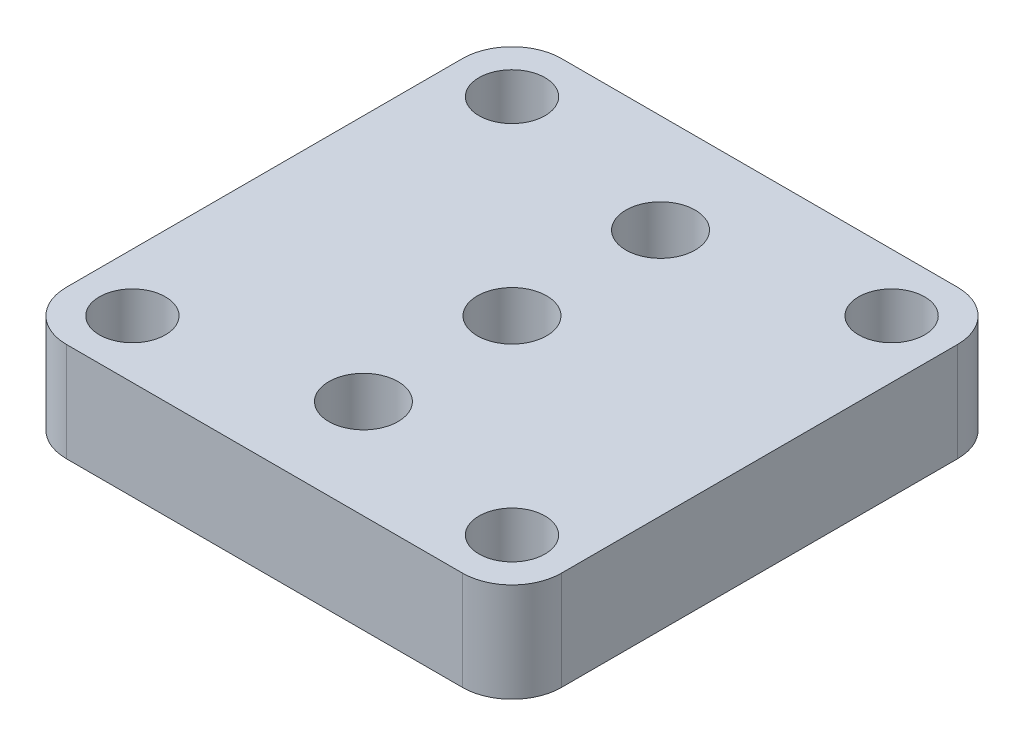
ISO-10303-21;
HEADER;
FILE_DESCRIPTION(('STEP AP214'),'2;1');
FILE_NAME('part.step','',(''),(''),'','','');
FILE_SCHEMA(('AUTOMOTIVE_DESIGN { 1 0 10303 214 1 1 1 1 }'));
ENDSEC;
DATA;
#1=APPLICATION_CONTEXT('core data for automotive mechanical design processes');
#2=APPLICATION_PROTOCOL_DEFINITION('international standard','automotive_design',2000,#1);
#3=PRODUCT_CONTEXT('',#1,'mechanical');
#4=PRODUCT('Part','Part','',(#3));
#5=PRODUCT_RELATED_PRODUCT_CATEGORY('part','',(#4));
#6=PRODUCT_DEFINITION_FORMATION('','',#4);
#7=PRODUCT_DEFINITION_CONTEXT('part definition',#1,'design');
#8=PRODUCT_DEFINITION('design','',#6,#7);
#9=PRODUCT_DEFINITION_SHAPE('','',#8);
#10=(LENGTH_UNIT() NAMED_UNIT(*) SI_UNIT(.MILLI.,.METRE.));
#11=(NAMED_UNIT(*) PLANE_ANGLE_UNIT() SI_UNIT($,.RADIAN.));
#12=(NAMED_UNIT(*) SI_UNIT($,.STERADIAN.) SOLID_ANGLE_UNIT());
#13=UNCERTAINTY_MEASURE_WITH_UNIT(LENGTH_MEASURE(1.E-05),#10,'distance_accuracy_value','');
#14=(GEOMETRIC_REPRESENTATION_CONTEXT(3) GLOBAL_UNCERTAINTY_ASSIGNED_CONTEXT((#13)) GLOBAL_UNIT_ASSIGNED_CONTEXT((#10,
#11,#12)) REPRESENTATION_CONTEXT('',''));
#15=CARTESIAN_POINT('',(0.,0.,0.));
#16=DIRECTION('',(0.,0.,1.));
#17=DIRECTION('',(1.,0.,0.));
#18=AXIS2_PLACEMENT_3D('',#15,#16,#17);
#19=CARTESIAN_POINT('',(12.,-6.,-12.));
#20=DIRECTION('',(0.,1.,0.));
#21=DIRECTION('',(0.,0.,1.));
#22=AXIS2_PLACEMENT_3D('',#19,#20,#21);
#23=CYLINDRICAL_SURFACE('',#22,3.);
#24=CARTESIAN_POINT('',(12.,0.,-12.));
#25=DIRECTION('',(0.,1.,0.));
#26=DIRECTION('',(0.,0.,1.));
#27=AXIS2_PLACEMENT_3D('',#24,#25,#26);
#28=CIRCLE('',#27,3.);
#29=CARTESIAN_POINT('',(15.,0.,-12.));
#30=VERTEX_POINT('',#29);
#31=CARTESIAN_POINT('',(12.,0.,-15.));
#32=VERTEX_POINT('',#31);
#33=EDGE_CURVE('E131',#30,#32,#28,.T.);
#34=ORIENTED_EDGE('',*,*,#33,.F.);
#35=DIRECTION('',(0.,1.,0.));
#36=VECTOR('',#35,1.);
#37=CARTESIAN_POINT('',(15.,-6.,-12.));
#38=LINE('',#37,#36);
#39=CARTESIAN_POINT('',(15.,-6.,-12.));
#40=VERTEX_POINT('',#39);
#41=EDGE_CURVE('E11',#40,#30,#38,.T.);
#42=ORIENTED_EDGE('',*,*,#41,.F.);
#43=CARTESIAN_POINT('',(12.,-6.,-12.));
#44=DIRECTION('',(0.,1.,0.));
#45=DIRECTION('',(0.,0.,1.));
#46=AXIS2_PLACEMENT_3D('',#43,#44,#45);
#47=CIRCLE('',#46,3.);
#48=CARTESIAN_POINT('',(12.,-6.,-15.));
#49=VERTEX_POINT('',#48);
#50=EDGE_CURVE('E152',#40,#49,#47,.T.);
#51=ORIENTED_EDGE('',*,*,#50,.T.);
#52=DIRECTION('',(0.,1.,0.));
#53=VECTOR('',#52,1.);
#54=CARTESIAN_POINT('',(12.,-6.,-15.));
#55=LINE('',#54,#53);
#56=EDGE_CURVE('E37',#49,#32,#55,.T.);
#57=ORIENTED_EDGE('',*,*,#56,.T.);
#58=EDGE_LOOP('',(#34,#42,#51,#57));
#59=FACE_BOUND('',#58,.T.);
#60=ADVANCED_FACE('F34',(#59),#23,.T.);
#61=CARTESIAN_POINT('',(15.,-6.,12.));
#62=DIRECTION('',(1.,0.,0.));
#63=DIRECTION('',(0.,0.,-1.));
#64=AXIS2_PLACEMENT_3D('',#61,#62,#63);
#65=PLANE('',#64);
#66=DIRECTION('',(0.,0.,-1.));
#67=VECTOR('',#66,1.);
#68=CARTESIAN_POINT('',(15.,0.,12.));
#69=LINE('',#68,#67);
#70=CARTESIAN_POINT('',(15.,0.,12.));
#71=VERTEX_POINT('',#70);
#72=EDGE_CURVE('E150',#71,#30,#69,.T.);
#73=ORIENTED_EDGE('',*,*,#72,.F.);
#74=DIRECTION('',(0.,1.,0.));
#75=VECTOR('',#74,1.);
#76=CARTESIAN_POINT('',(15.,-6.,12.));
#77=LINE('',#76,#75);
#78=CARTESIAN_POINT('',(15.,-6.,12.));
#79=VERTEX_POINT('',#78);
#80=EDGE_CURVE('E43',#79,#71,#77,.T.);
#81=ORIENTED_EDGE('',*,*,#80,.F.);
#82=DIRECTION('',(0.,0.,-1.));
#83=VECTOR('',#82,1.);
#84=CARTESIAN_POINT('',(15.,-6.,12.));
#85=LINE('',#84,#83);
#86=EDGE_CURVE('E121',#79,#40,#85,.T.);
#87=ORIENTED_EDGE('',*,*,#86,.T.);
#88=ORIENTED_EDGE('',*,*,#41,.T.);
#89=EDGE_LOOP('',(#73,#81,#87,#88));
#90=FACE_BOUND('',#89,.T.);
#91=ADVANCED_FACE('F164',(#90),#65,.T.);
#92=CARTESIAN_POINT('',(12.,-6.,12.));
#93=DIRECTION('',(0.,1.,0.));
#94=DIRECTION('',(0.,0.,1.));
#95=AXIS2_PLACEMENT_3D('',#92,#93,#94);
#96=CYLINDRICAL_SURFACE('',#95,3.);
#97=CARTESIAN_POINT('',(12.,0.,12.));
#98=DIRECTION('',(0.,1.,0.));
#99=DIRECTION('',(0.,0.,1.));
#100=AXIS2_PLACEMENT_3D('',#97,#98,#99);
#101=CIRCLE('',#100,3.);
#102=CARTESIAN_POINT('',(12.,0.,15.));
#103=VERTEX_POINT('',#102);
#104=EDGE_CURVE('E108',#103,#71,#101,.T.);
#105=ORIENTED_EDGE('',*,*,#104,.F.);
#106=DIRECTION('',(0.,1.,0.));
#107=VECTOR('',#106,1.);
#108=CARTESIAN_POINT('',(12.,-6.,15.));
#109=LINE('',#108,#107);
#110=CARTESIAN_POINT('',(12.,-6.,15.));
#111=VERTEX_POINT('',#110);
#112=EDGE_CURVE('E103',#111,#103,#109,.T.);
#113=ORIENTED_EDGE('',*,*,#112,.F.);
#114=CARTESIAN_POINT('',(12.,-6.,12.));
#115=DIRECTION('',(0.,1.,0.));
#116=DIRECTION('',(0.,0.,1.));
#117=AXIS2_PLACEMENT_3D('',#114,#115,#116);
#118=CIRCLE('',#117,3.);
#119=EDGE_CURVE('E106',#111,#79,#118,.T.);
#120=ORIENTED_EDGE('',*,*,#119,.T.);
#121=ORIENTED_EDGE('',*,*,#80,.T.);
#122=EDGE_LOOP('',(#105,#113,#120,#121));
#123=FACE_BOUND('',#122,.T.);
#124=ADVANCED_FACE('F105',(#123),#96,.T.);
#125=CARTESIAN_POINT('',(-12.,-6.,15.));
#126=DIRECTION('',(0.,0.,1.));
#127=DIRECTION('',(1.,0.,0.));
#128=AXIS2_PLACEMENT_3D('',#125,#126,#127);
#129=PLANE('',#128);
#130=DIRECTION('',(1.,0.,0.));
#131=VECTOR('',#130,1.);
#132=CARTESIAN_POINT('',(-12.,0.,15.));
#133=LINE('',#132,#131);
#134=CARTESIAN_POINT('',(-12.,0.,15.));
#135=VERTEX_POINT('',#134);
#136=EDGE_CURVE('E147',#135,#103,#133,.T.);
#137=ORIENTED_EDGE('',*,*,#136,.F.);
#138=DIRECTION('',(0.,1.,0.));
#139=VECTOR('',#138,1.);
#140=CARTESIAN_POINT('',(-12.,-6.,15.));
#141=LINE('',#140,#139);
#142=CARTESIAN_POINT('',(-12.,-6.,15.));
#143=VERTEX_POINT('',#142);
#144=EDGE_CURVE('E113',#143,#135,#141,.T.);
#145=ORIENTED_EDGE('',*,*,#144,.F.);
#146=DIRECTION('',(1.,0.,0.));
#147=VECTOR('',#146,1.);
#148=CARTESIAN_POINT('',(-12.,-6.,15.));
#149=LINE('',#148,#147);
#150=EDGE_CURVE('E119',#143,#111,#149,.T.);
#151=ORIENTED_EDGE('',*,*,#150,.T.);
#152=ORIENTED_EDGE('',*,*,#112,.T.);
#153=EDGE_LOOP('',(#137,#145,#151,#152));
#154=FACE_BOUND('',#153,.T.);
#155=ADVANCED_FACE('F123',(#154),#129,.T.);
#156=CARTESIAN_POINT('',(-12.,-6.,12.));
#157=DIRECTION('',(0.,1.,0.));
#158=DIRECTION('',(0.,0.,1.));
#159=AXIS2_PLACEMENT_3D('',#156,#157,#158);
#160=CYLINDRICAL_SURFACE('',#159,3.);
#161=CARTESIAN_POINT('',(-12.,0.,12.));
#162=DIRECTION('',(0.,1.,0.));
#163=DIRECTION('',(0.,0.,-1.));
#164=AXIS2_PLACEMENT_3D('',#161,#162,#163);
#165=CIRCLE('',#164,3.);
#166=CARTESIAN_POINT('',(-15.,0.,12.));
#167=VERTEX_POINT('',#166);
#168=EDGE_CURVE('E144',#167,#135,#165,.T.);
#169=ORIENTED_EDGE('',*,*,#168,.F.);
#170=DIRECTION('',(0.,1.,0.));
#171=VECTOR('',#170,1.);
#172=CARTESIAN_POINT('',(-15.,-6.,12.));
#173=LINE('',#172,#171);
#174=CARTESIAN_POINT('',(-15.,-6.,12.));
#175=VERTEX_POINT('',#174);
#176=EDGE_CURVE('E156',#175,#167,#173,.T.);
#177=ORIENTED_EDGE('',*,*,#176,.F.);
#178=CARTESIAN_POINT('',(-12.,-6.,12.));
#179=DIRECTION('',(0.,1.,0.));
#180=DIRECTION('',(0.,0.,-1.));
#181=AXIS2_PLACEMENT_3D('',#178,#179,#180);
#182=CIRCLE('',#181,3.);
#183=EDGE_CURVE('E124',#175,#143,#182,.T.);
#184=ORIENTED_EDGE('',*,*,#183,.T.);
#185=ORIENTED_EDGE('',*,*,#144,.T.);
#186=EDGE_LOOP('',(#169,#177,#184,#185));
#187=FACE_BOUND('',#186,.T.);
#188=ADVANCED_FACE('F177',(#187),#160,.T.);
#189=CARTESIAN_POINT('',(-15.,-6.,12.));
#190=DIRECTION('',(-1.,0.,0.));
#191=DIRECTION('',(0.,0.,1.));
#192=AXIS2_PLACEMENT_3D('',#189,#190,#191);
#193=PLANE('',#192);
#194=DIRECTION('',(0.,0.,1.));
#195=VECTOR('',#194,1.);
#196=CARTESIAN_POINT('',(-15.,0.,12.));
#197=LINE('',#196,#195);
#198=CARTESIAN_POINT('',(-15.,0.,-12.));
#199=VERTEX_POINT('',#198);
#200=EDGE_CURVE('E141',#199,#167,#197,.T.);
#201=ORIENTED_EDGE('',*,*,#200,.F.);
#202=DIRECTION('',(0.,1.,0.));
#203=VECTOR('',#202,1.);
#204=CARTESIAN_POINT('',(-15.,-6.,-12.));
#205=LINE('',#204,#203);
#206=CARTESIAN_POINT('',(-15.,-6.,-12.));
#207=VERTEX_POINT('',#206);
#208=EDGE_CURVE('E158',#207,#199,#205,.T.);
#209=ORIENTED_EDGE('',*,*,#208,.F.);
#210=DIRECTION('',(0.,0.,1.));
#211=VECTOR('',#210,1.);
#212=CARTESIAN_POINT('',(-15.,-6.,12.));
#213=LINE('',#212,#211);
#214=EDGE_CURVE('E126',#207,#175,#213,.T.);
#215=ORIENTED_EDGE('',*,*,#214,.T.);
#216=ORIENTED_EDGE('',*,*,#176,.T.);
#217=EDGE_LOOP('',(#201,#209,#215,#216));
#218=FACE_BOUND('',#217,.T.);
#219=ADVANCED_FACE('F180',(#218),#193,.T.);
#220=CARTESIAN_POINT('',(-12.,-6.,-12.));
#221=DIRECTION('',(0.,1.,0.));
#222=DIRECTION('',(0.,0.,1.));
#223=AXIS2_PLACEMENT_3D('',#220,#221,#222);
#224=CYLINDRICAL_SURFACE('',#223,3.);
#225=CARTESIAN_POINT('',(-12.,0.,-12.));
#226=DIRECTION('',(0.,1.,0.));
#227=DIRECTION('',(0.,0.,-1.));
#228=AXIS2_PLACEMENT_3D('',#225,#226,#227);
#229=CIRCLE('',#228,3.);
#230=CARTESIAN_POINT('',(-12.,0.,-15.));
#231=VERTEX_POINT('',#230);
#232=EDGE_CURVE('E138',#231,#199,#229,.T.);
#233=ORIENTED_EDGE('',*,*,#232,.F.);
#234=DIRECTION('',(0.,1.,0.));
#235=VECTOR('',#234,1.);
#236=CARTESIAN_POINT('',(-12.,-6.,-15.));
#237=LINE('',#236,#235);
#238=CARTESIAN_POINT('',(-12.,-6.,-15.));
#239=VERTEX_POINT('',#238);
#240=EDGE_CURVE('E159',#239,#231,#237,.T.);
#241=ORIENTED_EDGE('',*,*,#240,.F.);
#242=CARTESIAN_POINT('',(-12.,-6.,-12.));
#243=DIRECTION('',(0.,1.,0.));
#244=DIRECTION('',(0.,0.,-1.));
#245=AXIS2_PLACEMENT_3D('',#242,#243,#244);
#246=CIRCLE('',#245,3.);
#247=EDGE_CURVE('E276',#239,#207,#246,.T.);
#248=ORIENTED_EDGE('',*,*,#247,.T.);
#249=ORIENTED_EDGE('',*,*,#208,.T.);
#250=EDGE_LOOP('',(#233,#241,#248,#249));
#251=FACE_BOUND('',#250,.T.);
#252=ADVANCED_FACE('F184',(#251),#224,.T.);
#253=CARTESIAN_POINT('',(-12.,-6.,-15.));
#254=DIRECTION('',(0.,0.,-1.));
#255=DIRECTION('',(-1.,0.,0.));
#256=AXIS2_PLACEMENT_3D('',#253,#254,#255);
#257=PLANE('',#256);
#258=DIRECTION('',(-1.,0.,0.));
#259=VECTOR('',#258,1.);
#260=CARTESIAN_POINT('',(-12.,0.,-15.));
#261=LINE('',#260,#259);
#262=EDGE_CURVE('E134',#32,#231,#261,.T.);
#263=ORIENTED_EDGE('',*,*,#262,.F.);
#264=ORIENTED_EDGE('',*,*,#56,.F.);
#265=DIRECTION('',(-1.,0.,0.));
#266=VECTOR('',#265,1.);
#267=CARTESIAN_POINT('',(-12.,-6.,-15.));
#268=LINE('',#267,#266);
#269=EDGE_CURVE('E274',#49,#239,#268,.T.);
#270=ORIENTED_EDGE('',*,*,#269,.T.);
#271=ORIENTED_EDGE('',*,*,#240,.T.);
#272=EDGE_LOOP('',(#263,#264,#270,#271));
#273=FACE_BOUND('',#272,.T.);
#274=ADVANCED_FACE('F161',(#273),#257,.T.);
#275=CARTESIAN_POINT('',(12.,-6.,-12.));
#276=DIRECTION('',(0.,1.,0.));
#277=DIRECTION('',(0.,0.,1.));
#278=AXIS2_PLACEMENT_3D('',#275,#276,#277);
#279=PLANE('',#278);
#280=CARTESIAN_POINT('',(-11.4999999999994,-6.,11.5));
#281=DIRECTION('',(0.,1.,0.));
#282=DIRECTION('',(0.,0.,1.));
#283=AXIS2_PLACEMENT_3D('',#280,#281,#282);
#284=CIRCLE('',#283,2.);
#285=CARTESIAN_POINT('',(-11.4999999999994,-6.,13.5));
#286=VERTEX_POINT('',#285);
#287=EDGE_CURVE('E234',#286,#286,#284,.T.);
#288=ORIENTED_EDGE('',*,*,#287,.T.);
#289=EDGE_LOOP('',(#288));
#290=FACE_BOUND('',#289,.T.);
#291=CARTESIAN_POINT('',(-11.5,-6.,-11.5));
#292=DIRECTION('',(0.,1.,0.));
#293=DIRECTION('',(0.,0.,1.));
#294=AXIS2_PLACEMENT_3D('',#291,#292,#293);
#295=CIRCLE('',#294,2.);
#296=CARTESIAN_POINT('',(-11.5,-6.,-9.5));
#297=VERTEX_POINT('',#296);
#298=EDGE_CURVE('E238',#297,#297,#295,.T.);
#299=ORIENTED_EDGE('',*,*,#298,.T.);
#300=EDGE_LOOP('',(#299));
#301=FACE_BOUND('',#300,.T.);
#302=CARTESIAN_POINT('',(11.5,-6.,-11.5000000000006));
#303=DIRECTION('',(0.,1.,0.));
#304=DIRECTION('',(0.,0.,1.));
#305=AXIS2_PLACEMENT_3D('',#302,#303,#304);
#306=CIRCLE('',#305,2.);
#307=CARTESIAN_POINT('',(11.5,-6.,-9.50000000000056));
#308=VERTEX_POINT('',#307);
#309=EDGE_CURVE('E247',#308,#308,#306,.T.);
#310=ORIENTED_EDGE('',*,*,#309,.T.);
#311=EDGE_LOOP('',(#310));
#312=FACE_BOUND('',#311,.T.);
#313=CARTESIAN_POINT('',(11.5000000000006,-6.,11.4999999999994));
#314=DIRECTION('',(0.,1.,0.));
#315=DIRECTION('',(0.,0.,1.));
#316=AXIS2_PLACEMENT_3D('',#313,#314,#315);
#317=CIRCLE('',#316,2.);
#318=CARTESIAN_POINT('',(11.5000000000006,-6.,13.4999999999994));
#319=VERTEX_POINT('',#318);
#320=EDGE_CURVE('E253',#319,#319,#317,.T.);
#321=ORIENTED_EDGE('',*,*,#320,.T.);
#322=EDGE_LOOP('',(#321));
#323=FACE_BOUND('',#322,.T.);
#324=CARTESIAN_POINT('',(0.,-6.,0.));
#325=DIRECTION('',(0.,1.,0.));
#326=DIRECTION('',(0.,0.,1.));
#327=AXIS2_PLACEMENT_3D('',#324,#325,#326);
#328=CIRCLE('',#327,2.1);
#329=CARTESIAN_POINT('',(0.,-6.,2.1));
#330=VERTEX_POINT('',#329);
#331=EDGE_CURVE('E259',#330,#330,#328,.T.);
#332=ORIENTED_EDGE('',*,*,#331,.T.);
#333=EDGE_LOOP('',(#332));
#334=FACE_BOUND('',#333,.T.);
#335=CARTESIAN_POINT('',(0.,-6.,-9.));
#336=DIRECTION('',(0.,1.,0.));
#337=DIRECTION('',(0.,0.,1.));
#338=AXIS2_PLACEMENT_3D('',#335,#336,#337);
#339=CIRCLE('',#338,2.1);
#340=CARTESIAN_POINT('',(0.,-6.,-6.9));
#341=VERTEX_POINT('',#340);
#342=EDGE_CURVE('E265',#341,#341,#339,.T.);
#343=ORIENTED_EDGE('',*,*,#342,.T.);
#344=EDGE_LOOP('',(#343));
#345=FACE_BOUND('',#344,.T.);
#346=CARTESIAN_POINT('',(0.,-6.,9.));
#347=DIRECTION('',(0.,1.,0.));
#348=DIRECTION('',(0.,0.,1.));
#349=AXIS2_PLACEMENT_3D('',#346,#347,#348);
#350=CIRCLE('',#349,2.1);
#351=CARTESIAN_POINT('',(0.,-6.,11.1));
#352=VERTEX_POINT('',#351);
#353=EDGE_CURVE('E135',#352,#352,#350,.T.);
#354=ORIENTED_EDGE('',*,*,#353,.T.);
#355=EDGE_LOOP('',(#354));
#356=FACE_BOUND('',#355,.T.);
#357=ORIENTED_EDGE('',*,*,#50,.F.);
#358=ORIENTED_EDGE('',*,*,#86,.F.);
#359=ORIENTED_EDGE('',*,*,#119,.F.);
#360=ORIENTED_EDGE('',*,*,#150,.F.);
#361=ORIENTED_EDGE('',*,*,#183,.F.);
#362=ORIENTED_EDGE('',*,*,#214,.F.);
#363=ORIENTED_EDGE('',*,*,#247,.F.);
#364=ORIENTED_EDGE('',*,*,#269,.F.);
#365=EDGE_LOOP('',(#357,#358,#359,#360,#361,#362,#363,#364));
#366=FACE_BOUND('',#365,.T.);
#367=ADVANCED_FACE('F117',(#290,#301,#312,#323,#334,#345,#356,#366),#279,.F.);
#368=CARTESIAN_POINT('',(12.,0.,-12.));
#369=DIRECTION('',(0.,1.,0.));
#370=DIRECTION('',(0.,0.,1.));
#371=AXIS2_PLACEMENT_3D('',#368,#369,#370);
#372=PLANE('',#371);
#373=CARTESIAN_POINT('',(-11.4999999999994,0.,11.5));
#374=DIRECTION('',(0.,1.,0.));
#375=DIRECTION('',(0.,0.,1.));
#376=AXIS2_PLACEMENT_3D('',#373,#374,#375);
#377=CIRCLE('',#376,2.);
#378=CARTESIAN_POINT('',(-11.4999999999994,0.,13.5));
#379=VERTEX_POINT('',#378);
#380=EDGE_CURVE('E232',#379,#379,#377,.T.);
#381=ORIENTED_EDGE('',*,*,#380,.F.);
#382=EDGE_LOOP('',(#381));
#383=FACE_BOUND('',#382,.T.);
#384=CARTESIAN_POINT('',(-11.5,0.,-11.5));
#385=DIRECTION('',(0.,1.,0.));
#386=DIRECTION('',(0.,0.,1.));
#387=AXIS2_PLACEMENT_3D('',#384,#385,#386);
#388=CIRCLE('',#387,2.);
#389=CARTESIAN_POINT('',(-11.5,0.,-9.5));
#390=VERTEX_POINT('',#389);
#391=EDGE_CURVE('E235',#390,#390,#388,.T.);
#392=ORIENTED_EDGE('',*,*,#391,.F.);
#393=EDGE_LOOP('',(#392));
#394=FACE_BOUND('',#393,.T.);
#395=CARTESIAN_POINT('',(11.5,0.,-11.5000000000006));
#396=DIRECTION('',(0.,1.,0.));
#397=DIRECTION('',(0.,0.,1.));
#398=AXIS2_PLACEMENT_3D('',#395,#396,#397);
#399=CIRCLE('',#398,2.);
#400=CARTESIAN_POINT('',(11.5,0.,-9.50000000000056));
#401=VERTEX_POINT('',#400);
#402=EDGE_CURVE('E244',#401,#401,#399,.T.);
#403=ORIENTED_EDGE('',*,*,#402,.F.);
#404=EDGE_LOOP('',(#403));
#405=FACE_BOUND('',#404,.T.);
#406=CARTESIAN_POINT('',(11.5000000000006,0.,11.4999999999994));
#407=DIRECTION('',(0.,1.,0.));
#408=DIRECTION('',(0.,0.,1.));
#409=AXIS2_PLACEMENT_3D('',#406,#407,#408);
#410=CIRCLE('',#409,2.);
#411=CARTESIAN_POINT('',(11.5000000000006,0.,13.4999999999994));
#412=VERTEX_POINT('',#411);
#413=EDGE_CURVE('E250',#412,#412,#410,.T.);
#414=ORIENTED_EDGE('',*,*,#413,.F.);
#415=EDGE_LOOP('',(#414));
#416=FACE_BOUND('',#415,.T.);
#417=CARTESIAN_POINT('',(0.,0.,0.));
#418=DIRECTION('',(0.,1.,0.));
#419=DIRECTION('',(0.,0.,1.));
#420=AXIS2_PLACEMENT_3D('',#417,#418,#419);
#421=CIRCLE('',#420,2.09999999999999);
#422=CARTESIAN_POINT('',(0.,0.,2.09999999999999));
#423=VERTEX_POINT('',#422);
#424=EDGE_CURVE('E256',#423,#423,#421,.T.);
#425=ORIENTED_EDGE('',*,*,#424,.F.);
#426=EDGE_LOOP('',(#425));
#427=FACE_BOUND('',#426,.T.);
#428=CARTESIAN_POINT('',(0.,0.,-9.));
#429=DIRECTION('',(0.,1.,0.));
#430=DIRECTION('',(0.,0.,1.));
#431=AXIS2_PLACEMENT_3D('',#428,#429,#430);
#432=CIRCLE('',#431,2.09999999999999);
#433=CARTESIAN_POINT('',(0.,0.,-6.90000000000001));
#434=VERTEX_POINT('',#433);
#435=EDGE_CURVE('E262',#434,#434,#432,.T.);
#436=ORIENTED_EDGE('',*,*,#435,.F.);
#437=EDGE_LOOP('',(#436));
#438=FACE_BOUND('',#437,.T.);
#439=CARTESIAN_POINT('',(0.,0.,9.));
#440=DIRECTION('',(0.,1.,0.));
#441=DIRECTION('',(0.,0.,1.));
#442=AXIS2_PLACEMENT_3D('',#439,#440,#441);
#443=CIRCLE('',#442,2.09999999999999);
#444=CARTESIAN_POINT('',(0.,0.,11.1));
#445=VERTEX_POINT('',#444);
#446=EDGE_CURVE('E268',#445,#445,#443,.T.);
#447=ORIENTED_EDGE('',*,*,#446,.F.);
#448=EDGE_LOOP('',(#447));
#449=FACE_BOUND('',#448,.T.);
#450=ORIENTED_EDGE('',*,*,#33,.T.);
#451=ORIENTED_EDGE('',*,*,#262,.T.);
#452=ORIENTED_EDGE('',*,*,#232,.T.);
#453=ORIENTED_EDGE('',*,*,#200,.T.);
#454=ORIENTED_EDGE('',*,*,#168,.T.);
#455=ORIENTED_EDGE('',*,*,#136,.T.);
#456=ORIENTED_EDGE('',*,*,#104,.T.);
#457=ORIENTED_EDGE('',*,*,#72,.T.);
#458=EDGE_LOOP('',(#450,#451,#452,#453,#454,#455,#456,#457));
#459=FACE_BOUND('',#458,.T.);
#460=ADVANCED_FACE('F163',(#383,#394,#405,#416,#427,#438,#449,#459),#372,.T.);
#461=CARTESIAN_POINT('',(0.,0.,9.));
#462=DIRECTION('',(0.,1.,0.));
#463=DIRECTION('',(0.,0.,1.));
#464=AXIS2_PLACEMENT_3D('',#461,#462,#463);
#465=CYLINDRICAL_SURFACE('',#464,2.09999999999999);
#466=ORIENTED_EDGE('',*,*,#353,.F.);
#467=EDGE_LOOP('',(#466));
#468=FACE_BOUND('',#467,.T.);
#469=ORIENTED_EDGE('',*,*,#446,.T.);
#470=EDGE_LOOP('',(#469));
#471=FACE_BOUND('',#470,.T.);
#472=ADVANCED_FACE('F196',(#468,#471),#465,.F.);
#473=CARTESIAN_POINT('',(0.,0.,-9.));
#474=DIRECTION('',(0.,1.,0.));
#475=DIRECTION('',(0.,0.,1.));
#476=AXIS2_PLACEMENT_3D('',#473,#474,#475);
#477=CYLINDRICAL_SURFACE('',#476,2.09999999999999);
#478=ORIENTED_EDGE('',*,*,#342,.F.);
#479=EDGE_LOOP('',(#478));
#480=FACE_BOUND('',#479,.T.);
#481=ORIENTED_EDGE('',*,*,#435,.T.);
#482=EDGE_LOOP('',(#481));
#483=FACE_BOUND('',#482,.T.);
#484=ADVANCED_FACE('F203',(#480,#483),#477,.F.);
#485=CARTESIAN_POINT('',(0.,0.,0.));
#486=DIRECTION('',(0.,1.,0.));
#487=DIRECTION('',(0.,0.,1.));
#488=AXIS2_PLACEMENT_3D('',#485,#486,#487);
#489=CYLINDRICAL_SURFACE('',#488,2.09999999999999);
#490=ORIENTED_EDGE('',*,*,#331,.F.);
#491=EDGE_LOOP('',(#490));
#492=FACE_BOUND('',#491,.T.);
#493=ORIENTED_EDGE('',*,*,#424,.T.);
#494=EDGE_LOOP('',(#493));
#495=FACE_BOUND('',#494,.T.);
#496=ADVANCED_FACE('F207',(#492,#495),#489,.F.);
#497=CARTESIAN_POINT('',(11.5000000000006,0.,11.4999999999994));
#498=DIRECTION('',(0.,1.,0.));
#499=DIRECTION('',(0.,0.,1.));
#500=AXIS2_PLACEMENT_3D('',#497,#498,#499);
#501=CYLINDRICAL_SURFACE('',#500,2.);
#502=ORIENTED_EDGE('',*,*,#413,.T.);
#503=EDGE_LOOP('',(#502));
#504=FACE_BOUND('',#503,.T.);
#505=ORIENTED_EDGE('',*,*,#320,.F.);
#506=EDGE_LOOP('',(#505));
#507=FACE_BOUND('',#506,.T.);
#508=ADVANCED_FACE('F211',(#504,#507),#501,.F.);
#509=CARTESIAN_POINT('',(11.5,0.,-11.5000000000006));
#510=DIRECTION('',(0.,1.,0.));
#511=DIRECTION('',(0.,0.,1.));
#512=AXIS2_PLACEMENT_3D('',#509,#510,#511);
#513=CYLINDRICAL_SURFACE('',#512,2.);
#514=ORIENTED_EDGE('',*,*,#402,.T.);
#515=EDGE_LOOP('',(#514));
#516=FACE_BOUND('',#515,.T.);
#517=ORIENTED_EDGE('',*,*,#309,.F.);
#518=EDGE_LOOP('',(#517));
#519=FACE_BOUND('',#518,.T.);
#520=ADVANCED_FACE('F215',(#516,#519),#513,.F.);
#521=CARTESIAN_POINT('',(-11.5,0.,-11.5));
#522=DIRECTION('',(0.,1.,0.));
#523=DIRECTION('',(0.,0.,1.));
#524=AXIS2_PLACEMENT_3D('',#521,#522,#523);
#525=CYLINDRICAL_SURFACE('',#524,2.);
#526=ORIENTED_EDGE('',*,*,#391,.T.);
#527=EDGE_LOOP('',(#526));
#528=FACE_BOUND('',#527,.T.);
#529=ORIENTED_EDGE('',*,*,#298,.F.);
#530=EDGE_LOOP('',(#529));
#531=FACE_BOUND('',#530,.T.);
#532=ADVANCED_FACE('F219',(#528,#531),#525,.F.);
#533=CARTESIAN_POINT('',(-11.4999999999994,0.,11.5));
#534=DIRECTION('',(0.,1.,0.));
#535=DIRECTION('',(0.,0.,1.));
#536=AXIS2_PLACEMENT_3D('',#533,#534,#535);
#537=CYLINDRICAL_SURFACE('',#536,2.);
#538=ORIENTED_EDGE('',*,*,#380,.T.);
#539=EDGE_LOOP('',(#538));
#540=FACE_BOUND('',#539,.T.);
#541=ORIENTED_EDGE('',*,*,#287,.F.);
#542=EDGE_LOOP('',(#541));
#543=FACE_BOUND('',#542,.T.);
#544=ADVANCED_FACE('F223',(#540,#543),#537,.F.);
#545=CLOSED_SHELL('',(#60,#91,#124,#155,#188,#219,#252,#274,#367,#460,#472,#484,#496,#508,#520,
#532,#544));
#546=MANIFOLD_SOLID_BREP('B2',#545);
#547=ADVANCED_BREP_SHAPE_REPRESENTATION('',(#18,#546),#14);
#548=SHAPE_DEFINITION_REPRESENTATION(#9,#547);
ENDSEC;
END-ISO-10303-21;
